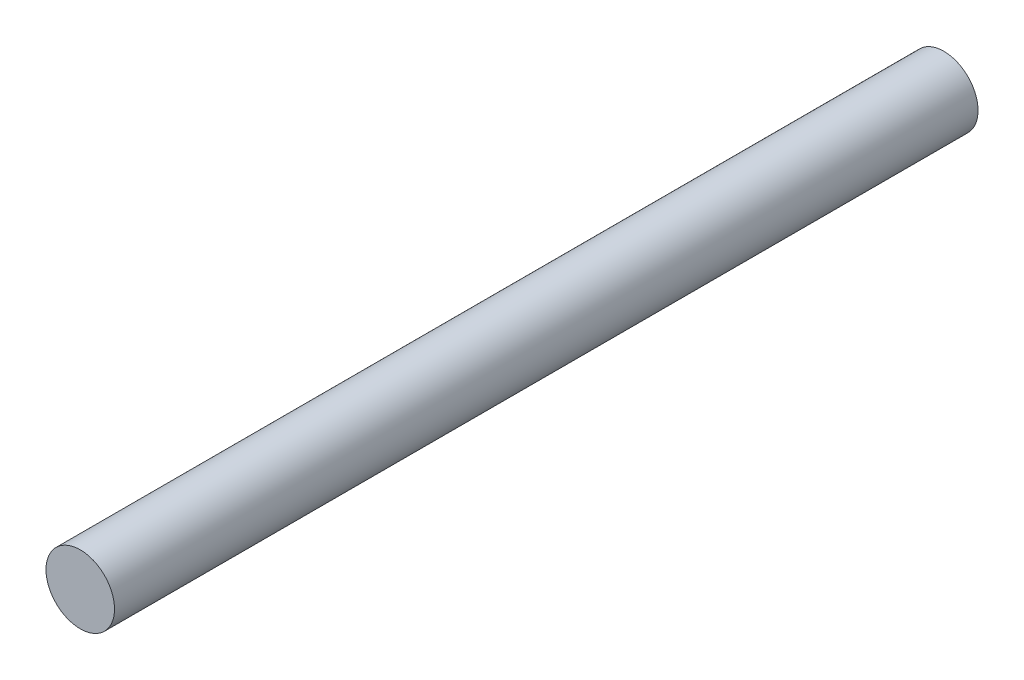
ISO-10303-21;
HEADER;
FILE_DESCRIPTION(('STEP AP214'),'2;1');
FILE_NAME('part.step','',(''),(''),'','','');
FILE_SCHEMA(('AUTOMOTIVE_DESIGN { 1 0 10303 214 1 1 1 1 }'));
ENDSEC;
DATA;
#1=APPLICATION_CONTEXT('core data for automotive mechanical design processes');
#2=APPLICATION_PROTOCOL_DEFINITION('international standard','automotive_design',2000,#1);
#3=PRODUCT_CONTEXT('',#1,'mechanical');
#4=PRODUCT('Part','Part','',(#3));
#5=PRODUCT_RELATED_PRODUCT_CATEGORY('part','',(#4));
#6=PRODUCT_DEFINITION_FORMATION('','',#4);
#7=PRODUCT_DEFINITION_CONTEXT('part definition',#1,'design');
#8=PRODUCT_DEFINITION('design','',#6,#7);
#9=PRODUCT_DEFINITION_SHAPE('','',#8);
#10=(LENGTH_UNIT() NAMED_UNIT(*) SI_UNIT(.MILLI.,.METRE.));
#11=(NAMED_UNIT(*) PLANE_ANGLE_UNIT() SI_UNIT($,.RADIAN.));
#12=(NAMED_UNIT(*) SI_UNIT($,.STERADIAN.) SOLID_ANGLE_UNIT());
#13=UNCERTAINTY_MEASURE_WITH_UNIT(LENGTH_MEASURE(1.E-05),#10,'distance_accuracy_value','');
#14=(GEOMETRIC_REPRESENTATION_CONTEXT(3) GLOBAL_UNCERTAINTY_ASSIGNED_CONTEXT((#13)) GLOBAL_UNIT_ASSIGNED_CONTEXT((#10,
#11,#12)) REPRESENTATION_CONTEXT('',''));
#15=CARTESIAN_POINT('',(0.,0.,0.));
#16=DIRECTION('',(0.,0.,1.));
#17=DIRECTION('',(1.,0.,0.));
#18=AXIS2_PLACEMENT_3D('',#15,#16,#17);
#19=CARTESIAN_POINT('',(0.,0.,315.08));
#20=DIRECTION('',(0.,0.,-1.));
#21=DIRECTION('',(-1.,0.,0.));
#22=AXIS2_PLACEMENT_3D('',#19,#20,#21);
#23=CYLINDRICAL_SURFACE('',#22,12.5);
#24=CARTESIAN_POINT('',(0.,0.,315.08));
#25=DIRECTION('',(0.,0.,1.));
#26=DIRECTION('',(1.,0.,0.));
#27=AXIS2_PLACEMENT_3D('',#24,#25,#26);
#28=CIRCLE('',#27,12.5);
#29=CARTESIAN_POINT('',(-12.5,0.,315.08));
#30=VERTEX_POINT('',#29);
#31=EDGE_CURVE('E10',#30,#30,#28,.T.);
#32=CARTESIAN_POINT('',(0.,0.,0.));
#33=DIRECTION('',(0.,0.,1.));
#34=DIRECTION('',(1.,0.,0.));
#35=AXIS2_PLACEMENT_3D('',#32,#33,#34);
#36=CIRCLE('',#35,12.5);
#37=CARTESIAN_POINT('',(-12.5,0.,0.));
#38=VERTEX_POINT('',#37);
#39=EDGE_CURVE('E34',#38,#38,#36,.T.);
#40=CARTESIAN_POINT('',(-12.5,0.,315.08));
#41=CARTESIAN_POINT('',(-12.5,0.,311.797916666667));
#42=CARTESIAN_POINT('',(-12.5,0.,308.515833333333));
#43=CARTESIAN_POINT('',(-12.5,0.,301.951666666667));
#44=CARTESIAN_POINT('',(-12.5,0.,298.669583333333));
#45=CARTESIAN_POINT('',(-12.5,0.,292.105416666667));
#46=CARTESIAN_POINT('',(-12.5,0.,288.823333333333));
#47=CARTESIAN_POINT('',(-12.5,0.,282.259166666667));
#48=CARTESIAN_POINT('',(-12.5,0.,278.977083333333));
#49=CARTESIAN_POINT('',(-12.5,0.,272.412916666667));
#50=CARTESIAN_POINT('',(-12.5,0.,269.130833333333));
#51=CARTESIAN_POINT('',(-12.5,0.,262.566666666667));
#52=CARTESIAN_POINT('',(-12.5,0.,259.284583333333));
#53=CARTESIAN_POINT('',(-12.5,0.,252.720416666667));
#54=CARTESIAN_POINT('',(-12.5,0.,249.438333333333));
#55=CARTESIAN_POINT('',(-12.5,0.,242.874166666667));
#56=CARTESIAN_POINT('',(-12.5,0.,239.592083333333));
#57=CARTESIAN_POINT('',(-12.5,0.,233.027916666667));
#58=CARTESIAN_POINT('',(-12.5,0.,229.745833333333));
#59=CARTESIAN_POINT('',(-12.5,0.,223.181666666667));
#60=CARTESIAN_POINT('',(-12.5,0.,219.899583333333));
#61=CARTESIAN_POINT('',(-12.5,0.,213.335416666667));
#62=CARTESIAN_POINT('',(-12.5,0.,210.053333333333));
#63=CARTESIAN_POINT('',(-12.5,0.,203.489166666667));
#64=CARTESIAN_POINT('',(-12.5,0.,200.207083333333));
#65=CARTESIAN_POINT('',(-12.5,0.,193.642916666667));
#66=CARTESIAN_POINT('',(-12.5,0.,190.360833333333));
#67=CARTESIAN_POINT('',(-12.5,0.,183.796666666667));
#68=CARTESIAN_POINT('',(-12.5,0.,180.514583333333));
#69=CARTESIAN_POINT('',(-12.5,0.,173.950416666667));
#70=CARTESIAN_POINT('',(-12.5,0.,170.668333333333));
#71=CARTESIAN_POINT('',(-12.5,0.,164.104166666667));
#72=CARTESIAN_POINT('',(-12.5,0.,160.822083333333));
#73=CARTESIAN_POINT('',(-12.5,0.,154.257916666667));
#74=CARTESIAN_POINT('',(-12.5,0.,150.975833333333));
#75=CARTESIAN_POINT('',(-12.5,0.,144.411666666667));
#76=CARTESIAN_POINT('',(-12.5,0.,141.129583333333));
#77=CARTESIAN_POINT('',(-12.5,0.,134.565416666667));
#78=CARTESIAN_POINT('',(-12.5,0.,131.283333333333));
#79=CARTESIAN_POINT('',(-12.5,0.,124.719166666667));
#80=CARTESIAN_POINT('',(-12.5,0.,121.437083333333));
#81=CARTESIAN_POINT('',(-12.5,0.,114.872916666667));
#82=CARTESIAN_POINT('',(-12.5,0.,111.590833333333));
#83=CARTESIAN_POINT('',(-12.5,0.,105.026666666667));
#84=CARTESIAN_POINT('',(-12.5,0.,101.744583333333));
#85=CARTESIAN_POINT('',(-12.5,0.,95.1804166666666));
#86=CARTESIAN_POINT('',(-12.5,0.,91.8983333333333));
#87=CARTESIAN_POINT('',(-12.5,0.,85.3341666666666));
#88=CARTESIAN_POINT('',(-12.5,0.,82.0520833333333));
#89=CARTESIAN_POINT('',(-12.5,0.,75.4879166666666));
#90=CARTESIAN_POINT('',(-12.5,0.,72.2058333333333));
#91=CARTESIAN_POINT('',(-12.5,0.,65.6416666666666));
#92=CARTESIAN_POINT('',(-12.5,0.,62.3595833333333));
#93=CARTESIAN_POINT('',(-12.5,0.,55.7954166666667));
#94=CARTESIAN_POINT('',(-12.5,0.,52.5133333333333));
#95=CARTESIAN_POINT('',(-12.5,0.,45.9491666666667));
#96=CARTESIAN_POINT('',(-12.5,0.,42.6670833333333));
#97=CARTESIAN_POINT('',(-12.5,0.,36.1029166666667));
#98=CARTESIAN_POINT('',(-12.5,0.,32.8208333333333));
#99=CARTESIAN_POINT('',(-12.5,0.,26.2566666666667));
#100=CARTESIAN_POINT('',(-12.5,0.,22.9745833333333));
#101=CARTESIAN_POINT('',(-12.5,0.,16.4104166666667));
#102=CARTESIAN_POINT('',(-12.5,0.,13.1283333333333));
#103=CARTESIAN_POINT('',(-12.5,0.,6.56416666666667));
#104=CARTESIAN_POINT('',(-12.5,0.,3.28208333333334));
#105=CARTESIAN_POINT('',(-12.5,0.,0.));
#106=B_SPLINE_CURVE_WITH_KNOTS('',3,(#40,#41,#42,#43,#44,#45,#46,#47,#48,#49,#50,#51,#52,#53,
#54,#55,#56,#57,#58,#59,#60,#61,#62,#63,#64,#65,#66,#67,#68,#69,#70,#71,#72,#73,#74,#75,#76,#77,
#78,#79,#80,#81,#82,#83,#84,#85,#86,#87,#88,#89,#90,#91,#92,#93,#94,#95,#96,#97,#98,#99,#100,
#101,#102,#103,#104,#105),.UNSPECIFIED.,.F.,.F.,(4,2,2,2,2,2,2,2,2,2,2,2,2,2,2,2,2,2,2,2,2,2,2,
2,2,2,2,2,2,2,2,2,4),(0.,9.84625,19.6925,29.53875,39.385,49.23125,59.0775,68.92375,78.77,
88.61625,98.4625,108.30875,118.155,128.00125,137.8475,147.69375,157.54,167.38625,177.2325,
187.07875,196.925,206.77125,216.6175,226.46375,236.31,246.15625,256.0025,265.84875,275.695,
285.54125,295.3875,305.23375,315.08),.UNSPECIFIED.);
#107=EDGE_CURVE('BSEAM31',#30,#38,#106,.T.);
#108=ORIENTED_EDGE('',*,*,#31,.F.);
#109=ORIENTED_EDGE('',*,*,#39,.T.);
#110=ORIENTED_EDGE('',*,*,#107,.T.);
#111=ORIENTED_EDGE('',*,*,#107,.F.);
#112=EDGE_LOOP('',(#108,#110,#109,#111));
#113=FACE_BOUND('',#112,.T.);
#114=ADVANCED_FACE('F31',(#113),#23,.T.);
#115=CARTESIAN_POINT('',(0.,0.,315.08));
#116=DIRECTION('',(0.,0.,1.));
#117=DIRECTION('',(1.,0.,0.));
#118=AXIS2_PLACEMENT_3D('',#115,#116,#117);
#119=PLANE('',#118);
#120=ORIENTED_EDGE('',*,*,#31,.T.);
#121=EDGE_LOOP('',(#120));
#122=FACE_BOUND('',#121,.T.);
#123=ADVANCED_FACE('F46',(#122),#119,.T.);
#124=CARTESIAN_POINT('',(0.,0.,0.));
#125=DIRECTION('',(0.,0.,1.));
#126=DIRECTION('',(1.,0.,0.));
#127=AXIS2_PLACEMENT_3D('',#124,#125,#126);
#128=PLANE('',#127);
#129=ORIENTED_EDGE('',*,*,#39,.F.);
#130=EDGE_LOOP('',(#129));
#131=FACE_BOUND('',#130,.T.);
#132=ADVANCED_FACE('F44',(#131),#128,.F.);
#133=CLOSED_SHELL('',(#114,#123,#132));
#134=MANIFOLD_SOLID_BREP('B2',#133);
#135=ADVANCED_BREP_SHAPE_REPRESENTATION('',(#18,#134),#14);
#136=SHAPE_DEFINITION_REPRESENTATION(#9,#135);
ENDSEC;
END-ISO-10303-21;
